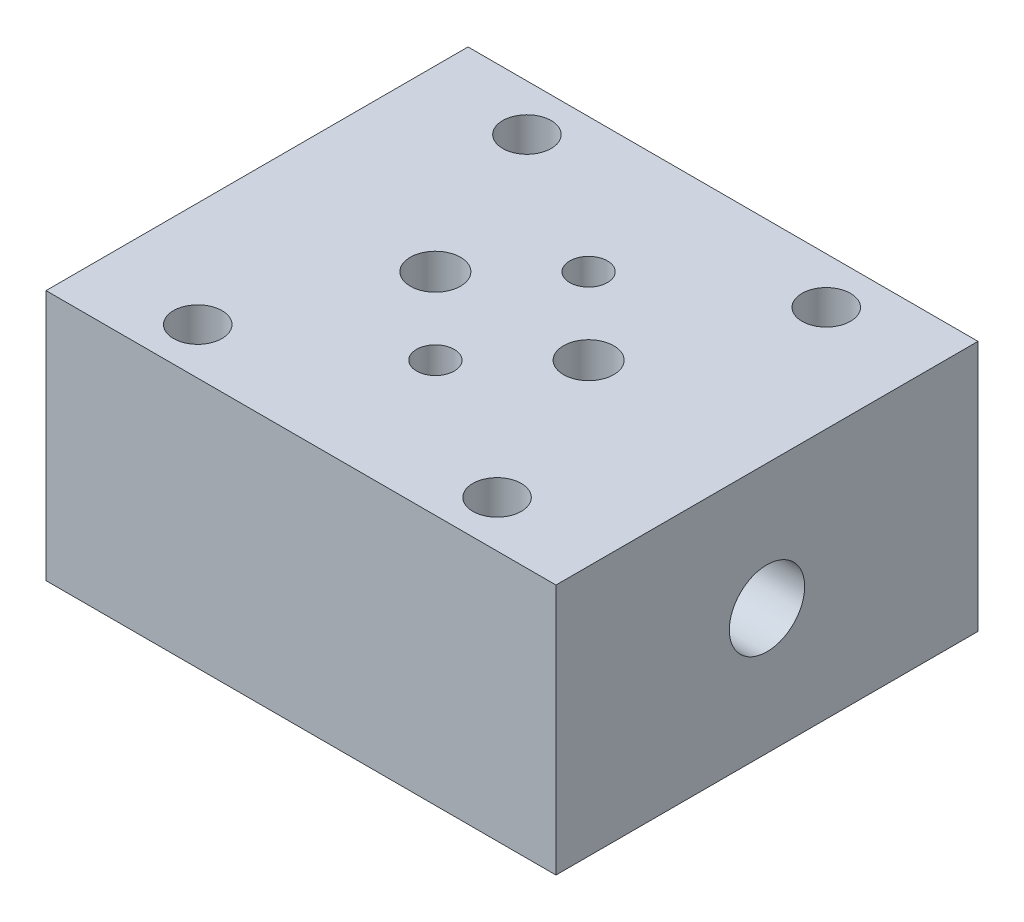
ISO-10303-21;
HEADER;
FILE_DESCRIPTION(('STEP AP214'),'2;1');
FILE_NAME('part.step','',(''),(''),'','','');
FILE_SCHEMA(('AUTOMOTIVE_DESIGN { 1 0 10303 214 1 1 1 1 }'));
ENDSEC;
DATA;
#1=APPLICATION_CONTEXT('core data for automotive mechanical design processes');
#2=APPLICATION_PROTOCOL_DEFINITION('international standard','automotive_design',2000,#1);
#3=PRODUCT_CONTEXT('',#1,'mechanical');
#4=PRODUCT('Part','Part','',(#3));
#5=PRODUCT_RELATED_PRODUCT_CATEGORY('part','',(#4));
#6=PRODUCT_DEFINITION_FORMATION('','',#4);
#7=PRODUCT_DEFINITION_CONTEXT('part definition',#1,'design');
#8=PRODUCT_DEFINITION('design','',#6,#7);
#9=PRODUCT_DEFINITION_SHAPE('','',#8);
#10=(LENGTH_UNIT() NAMED_UNIT(*) SI_UNIT(.MILLI.,.METRE.));
#11=(NAMED_UNIT(*) PLANE_ANGLE_UNIT() SI_UNIT($,.RADIAN.));
#12=(NAMED_UNIT(*) SI_UNIT($,.STERADIAN.) SOLID_ANGLE_UNIT());
#13=UNCERTAINTY_MEASURE_WITH_UNIT(LENGTH_MEASURE(1.E-05),#10,'distance_accuracy_value','');
#14=(GEOMETRIC_REPRESENTATION_CONTEXT(3) GLOBAL_UNCERTAINTY_ASSIGNED_CONTEXT((#13)) GLOBAL_UNIT_ASSIGNED_CONTEXT((#10,
#11,#12)) REPRESENTATION_CONTEXT('',''));
#15=CARTESIAN_POINT('',(0.,0.,0.));
#16=DIRECTION('',(0.,0.,1.));
#17=DIRECTION('',(1.,0.,0.));
#18=AXIS2_PLACEMENT_3D('',#15,#16,#17);
#19=CARTESIAN_POINT('',(19.4007998037815,5.,6.48538918452007));
#20=DIRECTION('',(0.,1.,0.));
#21=DIRECTION('',(0.,0.,1.));
#22=AXIS2_PLACEMENT_3D('',#19,#20,#21);
#23=CYLINDRICAL_SURFACE('',#22,2.);
#24=CARTESIAN_POINT('',(19.4007998037815,20.,6.48538918452007));
#25=DIRECTION('',(0.,1.,0.));
#26=DIRECTION('',(0.,0.,1.));
#27=AXIS2_PLACEMENT_3D('',#24,#25,#26);
#28=CIRCLE('',#27,2.);
#29=CARTESIAN_POINT('',(19.4007998037815,20.,8.48538918452007));
#30=VERTEX_POINT('',#29);
#31=EDGE_CURVE('E143',#30,#30,#28,.T.);
#32=ORIENTED_EDGE('',*,*,#31,.T.);
#33=EDGE_LOOP('',(#32));
#34=FACE_BOUND('',#33,.T.);
#35=CARTESIAN_POINT('',(19.4007998037815,5.,6.48538918452007));
#36=DIRECTION('',(0.,1.,0.));
#37=DIRECTION('',(0.,0.,1.));
#38=AXIS2_PLACEMENT_3D('',#35,#36,#37);
#39=CIRCLE('',#38,2.);
#40=CARTESIAN_POINT('',(19.4007998037815,5.,8.48538918452007));
#41=VERTEX_POINT('',#40);
#42=EDGE_CURVE('E146',#41,#41,#39,.T.);
#43=ORIENTED_EDGE('',*,*,#42,.F.);
#44=EDGE_LOOP('',(#43));
#45=FACE_BOUND('',#44,.T.);
#46=DIRECTION('',(0.,1.,0.));
#47=VECTOR('',#46,1.);
#48=CARTESIAN_POINT('',(19.4007998037815,5.,4.48538918452006));
#49=LINE('',#48,#47);
#50=CARTESIAN_POINT('',(19.4007998037815,12.2360679774998,4.48538918452006));
#51=VERTEX_POINT('',#50);
#52=CARTESIAN_POINT('',(19.4007998037815,7.76393202250021,4.48538918452006));
#53=VERTEX_POINT('',#52);
#54=EDGE_CURVE('E11',#51,#53,#49,.F.);
#55=ORIENTED_EDGE('',*,*,#54,.F.);
#56=CARTESIAN_POINT('',(19.4007998037815,12.2360679774998,4.48538918452006));
#57=CARTESIAN_POINT('',(19.4499647734324,12.2360408995684,4.48537636616661));
#58=CARTESIAN_POINT('',(19.4991129010475,12.2376887690479,4.48720150235003));
#59=CARTESIAN_POINT('',(19.596874810353,12.2441260715054,4.49442461517438));
#60=CARTESIAN_POINT('',(19.6454892194808,12.2489112944528,4.49981780391529));
#61=CARTESIAN_POINT('',(19.7413417652535,12.2613543003402,4.51400410998131));
#62=CARTESIAN_POINT('',(19.7885887489332,12.2689832714284,4.52276315227782));
#63=CARTESIAN_POINT('',(19.8818763751846,12.2867743269629,4.54352130390386));
#64=CARTESIAN_POINT('',(19.9279166625893,12.2969371481469,4.55552135566803));
#65=CARTESIAN_POINT('',(20.0633515173793,12.3305283350678,4.59598157941095));
#66=CARTESIAN_POINT('',(20.1506379552706,12.3571426521571,4.62899053998672));
#67=CARTESIAN_POINT('',(20.3184687006029,12.415757884936,4.7059357345117));
#68=CARTESIAN_POINT('',(20.3989929659931,12.4477740215534,4.74990301806204));
#69=CARTESIAN_POINT('',(20.5644663946895,12.51947102857,4.85538006993717));
#70=CARTESIAN_POINT('',(20.6481780443333,12.5595719731871,4.91855045360234));
#71=CARTESIAN_POINT('',(20.8048454458022,12.63947107422,5.05724020255702));
#72=CARTESIAN_POINT('',(20.8777967624043,12.6792690994033,5.13276463307106));
#73=CARTESIAN_POINT('',(21.0214392729996,12.7608860193993,5.3072276798983));
#74=CARTESIAN_POINT('',(21.090275565014,12.8021638764738,5.40797301827075));
#75=CARTESIAN_POINT('',(21.2094371942173,12.875581769195,5.62290729270841));
#76=CARTESIAN_POINT('',(21.2597814560676,12.9077311392013,5.73708232596091));
#77=CARTESIAN_POINT('',(21.3343563045126,12.9559991552633,5.96214048983405));
#78=CARTESIAN_POINT('',(21.3608833307903,12.9735118806818,6.07195524704095));
#79=CARTESIAN_POINT('',(21.3949843553362,12.9960974921886,6.29569455234626));
#80=CARTESIAN_POINT('',(21.4025823571678,13.0011861328765,6.40961370946628));
#81=CARTESIAN_POINT('',(21.3986273520446,12.9985536167691,6.61953624798767));
#82=CARTESIAN_POINT('',(21.3898107500567,12.9926626472388,6.71562985022697));
#83=CARTESIAN_POINT('',(21.3587087458107,12.9720818238004,6.90462784489725));
#84=CARTESIAN_POINT('',(21.3364223651727,12.9573913307379,6.99753200514443));
#85=CARTESIAN_POINT('',(21.279604124101,12.9205209186642,7.1774671129613));
#86=CARTESIAN_POINT('',(21.2451209342582,12.8983707834527,7.26451979082876));
#87=CARTESIAN_POINT('',(21.1652461617187,12.8482110515085,7.43159831808515));
#88=CARTESIAN_POINT('',(21.119852585565,12.8202003841082,7.51162287970124));
#89=CARTESIAN_POINT('',(21.0128202851267,12.7561800916327,7.67367471608597));
#90=CARTESIAN_POINT('',(20.9498306112334,12.7196030196958,7.7545830018452));
#91=CARTESIAN_POINT('',(20.8128988459059,12.6440049067215,7.90537926948233));
#92=CARTESIAN_POINT('',(20.7389401698465,12.6049802174796,7.97525022720393));
#93=CARTESIAN_POINT('',(20.5688505255753,12.5215069196579,8.11310077854603));
#94=CARTESIAN_POINT('',(20.4710597945213,12.4771559177186,8.17910592928687));
#95=CARTESIAN_POINT('',(20.2633197038193,12.3947675164153,8.29372355769806));
#96=CARTESIAN_POINT('',(20.1533875098997,12.3567213888442,8.34236018927069));
#97=CARTESIAN_POINT('',(19.955476751104,12.3024605615746,8.40892213386435));
#98=CARTESIAN_POINT('',(19.8699675040186,12.2831159097976,8.43163329778911));
#99=CARTESIAN_POINT('',(19.6952660433623,12.2537482390292,8.46557647402768));
#100=CARTESIAN_POINT('',(19.6060871054216,12.2436942570448,8.47684662823674));
#101=CARTESIAN_POINT('',(19.4971782249571,12.238059656323,8.48315977191144));
#102=CARTESIAN_POINT('',(19.4779171509589,12.2373135596547,8.48399546689792));
#103=CARTESIAN_POINT('',(19.4393727552987,12.2363185501528,8.48510952167194));
#104=CARTESIAN_POINT('',(19.4200894437074,12.2360694644473,8.48538807524626));
#105=CARTESIAN_POINT('',(19.4007998037814,12.2360679775017,8.48538918452008));
#106=B_SPLINE_CURVE_WITH_KNOTS('',3,(#56,#57,#58,#59,#60,#61,#62,#63,#64,#65,#66,#67,#68,#69,
#70,#71,#72,#73,#74,#75,#76,#77,#78,#79,#80,#81,#82,#83,#84,#85,#86,#87,#88,#89,#90,#91,#92,#93,
#94,#95,#96,#97,#98,#99,#100,#101,#102,#103,#104,#105),.UNSPECIFIED.,.F.,.F.,(4,2,2,2,2,2,2,2,2,
2,2,2,2,2,2,2,2,2,2,2,2,2,2,2,4),(0.,0.147406300687013,0.294615199850158,0.440371468528525,
0.586170166557266,0.876018614460536,1.16669785357649,1.50227319340302,1.8379864673532,
2.22228321167105,2.60618556535439,2.94700730730402,3.28739663869946,3.57602666306446,
3.86467765464593,4.15218956183312,4.43975404084692,4.765111211512,5.09096541903239,
5.46736342837469,5.84323593441965,6.11388644404437,6.38363166955506,6.44150448447684,
6.49935716638087),.UNSPECIFIED.);
#107=CARTESIAN_POINT('',(19.4007998037815,12.2360679774998,8.48538918452007));
#108=VERTEX_POINT('',#107);
#109=EDGE_CURVE('E39',#51,#108,#106,.T.);
#110=ORIENTED_EDGE('',*,*,#109,.T.);
#111=DIRECTION('',(0.,1.,0.));
#112=VECTOR('',#111,1.);
#113=CARTESIAN_POINT('',(19.4007998037815,5.,8.48538918452007));
#114=LINE('',#113,#112);
#115=CARTESIAN_POINT('',(19.4007998037815,7.76393202250021,8.48538918452007));
#116=VERTEX_POINT('',#115);
#117=EDGE_CURVE('E105',#116,#108,#114,.T.);
#118=ORIENTED_EDGE('',*,*,#117,.F.);
#119=CARTESIAN_POINT('',(19.4007998037815,7.76393202250021,8.48538918452007));
#120=CARTESIAN_POINT('',(19.4499647734324,7.76395910043157,8.48540200287352));
#121=CARTESIAN_POINT('',(19.4991129010475,7.76231123095212,8.48357686669011));
#122=CARTESIAN_POINT('',(19.596874810353,7.75587392849462,8.47635375386575));
#123=CARTESIAN_POINT('',(19.6454892194808,7.75108870554722,8.47096056512484));
#124=CARTESIAN_POINT('',(19.7413417652535,7.73864569965977,8.45677425905883));
#125=CARTESIAN_POINT('',(19.7885887489332,7.73101672857161,8.44801521676232));
#126=CARTESIAN_POINT('',(19.8818763751846,7.71322567303706,8.42725706513627));
#127=CARTESIAN_POINT('',(19.9279166625893,7.70306285185305,8.4152570133721));
#128=CARTESIAN_POINT('',(20.0633515173793,7.66947166493216,8.37479678962918));
#129=CARTESIAN_POINT('',(20.1506379552706,7.64285734784288,8.34178782905342));
#130=CARTESIAN_POINT('',(20.3184687006029,7.58424211506401,8.26484263452844));
#131=CARTESIAN_POINT('',(20.3989929659931,7.55222597844662,8.22087535097809));
#132=CARTESIAN_POINT('',(20.5644663946895,7.48052897142999,8.11539829910296));
#133=CARTESIAN_POINT('',(20.6481780443333,7.44042802681293,8.05222791543779));
#134=CARTESIAN_POINT('',(20.8048454458022,7.36052892578002,7.91353816648311));
#135=CARTESIAN_POINT('',(20.8777967624043,7.3207309005967,7.83801373596908));
#136=CARTESIAN_POINT('',(21.0214392729996,7.2391139806007,7.66355068914183));
#137=CARTESIAN_POINT('',(21.090275565014,7.19783612352618,7.56280535076938));
#138=CARTESIAN_POINT('',(21.2094371942173,7.12441823080498,7.34787107633172));
#139=CARTESIAN_POINT('',(21.2597814560676,7.09226886079873,7.23369604307923));
#140=CARTESIAN_POINT('',(21.3343563045126,7.04400084473673,7.00863787920608));
#141=CARTESIAN_POINT('',(21.3608833307903,7.02648811931819,6.89882312199919));
#142=CARTESIAN_POINT('',(21.3949843553362,7.00390250781142,6.67508381669387));
#143=CARTESIAN_POINT('',(21.4025823571678,6.99881386712345,6.56116465957385));
#144=CARTESIAN_POINT('',(21.3986273520446,7.00144638323092,6.35124212105246));
#145=CARTESIAN_POINT('',(21.3898107500567,7.0073373527612,6.25514851881316));
#146=CARTESIAN_POINT('',(21.3587087458107,7.0279181761996,6.06615052414288));
#147=CARTESIAN_POINT('',(21.3364223651727,7.04260866926207,5.9732463638957));
#148=CARTESIAN_POINT('',(21.279604124101,7.07947908133583,5.79331125607883));
#149=CARTESIAN_POINT('',(21.2451209342582,7.10162921654726,5.70625857821138));
#150=CARTESIAN_POINT('',(21.1652461617187,7.15178894849146,5.53918005095498));
#151=CARTESIAN_POINT('',(21.119852585565,7.17979961589179,5.4591554893389));
#152=CARTESIAN_POINT('',(21.0128202851267,7.24381990836728,5.29710365295417));
#153=CARTESIAN_POINT('',(20.9498306112334,7.28039698030419,5.21619536719493));
#154=CARTESIAN_POINT('',(20.8128988459059,7.35599509327846,5.0653990995578));
#155=CARTESIAN_POINT('',(20.7389401698465,7.3950197825204,4.9955281418362));
#156=CARTESIAN_POINT('',(20.5688505255753,7.47849308034207,4.8576775904941));
#157=CARTESIAN_POINT('',(20.4710597945213,7.52284408228136,4.79167243975326));
#158=CARTESIAN_POINT('',(20.2633197038193,7.60523248358472,4.67705481134208));
#159=CARTESIAN_POINT('',(20.1533875098997,7.64327861115585,4.62841817976945));
#160=CARTESIAN_POINT('',(19.955476751104,7.69753943842541,4.56185623517579));
#161=CARTESIAN_POINT('',(19.8699675040186,7.71688409020236,4.53914507125102));
#162=CARTESIAN_POINT('',(19.6952660433623,7.74625176097085,4.50520189501245));
#163=CARTESIAN_POINT('',(19.6060871054216,7.75630574295522,4.4939317408034));
#164=CARTESIAN_POINT('',(19.4971782249571,7.76194034367702,4.48761859712869));
#165=CARTESIAN_POINT('',(19.4779171509589,7.76268644034534,4.48678290214222));
#166=CARTESIAN_POINT('',(19.4393727552987,7.7636814498472,4.4856688473682));
#167=CARTESIAN_POINT('',(19.4200894437074,7.76393053555267,4.48539029379388));
#168=CARTESIAN_POINT('',(19.4007998037814,7.76393202249831,4.48538918452005));
#169=B_SPLINE_CURVE_WITH_KNOTS('',3,(#119,#120,#121,#122,#123,#124,#125,#126,#127,#128,#129,
#130,#131,#132,#133,#134,#135,#136,#137,#138,#139,#140,#141,#142,#143,#144,#145,#146,#147,#148,
#149,#150,#151,#152,#153,#154,#155,#156,#157,#158,#159,#160,#161,#162,#163,#164,#165,#166,#167,
#168),.UNSPECIFIED.,.F.,.F.,(4,2,2,2,2,2,2,2,2,2,2,2,2,2,2,2,2,2,2,2,2,2,2,2,4),(0.,
0.147406300687014,0.294615199850157,0.440371468528529,0.586170166557266,0.876018614460532,
1.16669785357649,1.50227319340302,1.8379864673532,2.22228321167105,2.60618556535439,
2.94700730730402,3.28739663869946,3.57602666306446,3.86467765464593,4.15218956183312,
4.43975404084692,4.76511121151201,5.09096541903239,5.46736342837469,5.84323593441965,
6.11388644404436,6.38363166955505,6.44150448447684,6.49935716638087),.UNSPECIFIED.);
#170=EDGE_CURVE('E100',#116,#53,#169,.T.);
#171=ORIENTED_EDGE('',*,*,#170,.T.);
#172=EDGE_LOOP('',(#55,#110,#118,#171));
#173=FACE_BOUND('',#172,.T.);
#174=ADVANCED_FACE('F31',(#34,#45,#173),#23,.F.);
#175=CARTESIAN_POINT('',(-6.99920019621852,20.,-10.3146108154799));
#176=DIRECTION('',(1.,0.,0.));
#177=DIRECTION('',(0.,0.,-1.));
#178=AXIS2_PLACEMENT_3D('',#175,#176,#177);
#179=PLANE('',#178);
#180=DIRECTION('',(0.,0.,1.));
#181=VECTOR('',#180,1.);
#182=CARTESIAN_POINT('',(-6.99920019621852,0.,-10.3146108154799));
#183=LINE('',#182,#181);
#184=CARTESIAN_POINT('',(-6.99920019621852,0.,-10.3146108154799));
#185=VERTEX_POINT('',#184);
#186=CARTESIAN_POINT('',(-6.99920019621852,0.,23.2853891845201));
#187=VERTEX_POINT('',#186);
#188=EDGE_CURVE('E192',#185,#187,#183,.T.);
#189=ORIENTED_EDGE('',*,*,#188,.T.);
#190=DIRECTION('',(0.,-1.,0.));
#191=VECTOR('',#190,1.);
#192=CARTESIAN_POINT('',(-6.99920019621852,20.,23.2853891845201));
#193=LINE('',#192,#191);
#194=CARTESIAN_POINT('',(-6.99920019621852,20.,23.2853891845201));
#195=VERTEX_POINT('',#194);
#196=EDGE_CURVE('E107',#195,#187,#193,.T.);
#197=ORIENTED_EDGE('',*,*,#196,.F.);
#198=DIRECTION('',(0.,0.,1.));
#199=VECTOR('',#198,1.);
#200=CARTESIAN_POINT('',(-6.99920019621852,20.,-10.3146108154799));
#201=LINE('',#200,#199);
#202=CARTESIAN_POINT('',(-6.99920019621852,20.,-10.3146108154799));
#203=VERTEX_POINT('',#202);
#204=EDGE_CURVE('E195',#203,#195,#201,.T.);
#205=ORIENTED_EDGE('',*,*,#204,.F.);
#206=DIRECTION('',(0.,-1.,0.));
#207=VECTOR('',#206,1.);
#208=CARTESIAN_POINT('',(-6.99920019621852,20.,-10.3146108154799));
#209=LINE('',#208,#207);
#210=EDGE_CURVE('E201',#203,#185,#209,.T.);
#211=ORIENTED_EDGE('',*,*,#210,.T.);
#212=EDGE_LOOP('',(#189,#197,#205,#211));
#213=FACE_BOUND('',#212,.T.);
#214=ADVANCED_FACE('F33',(#213),#179,.F.);
#215=CARTESIAN_POINT('',(-6.99920019621852,20.,23.2853891845201));
#216=DIRECTION('',(0.,0.,-1.));
#217=DIRECTION('',(-1.,0.,0.));
#218=AXIS2_PLACEMENT_3D('',#215,#216,#217);
#219=PLANE('',#218);
#220=DIRECTION('',(1.,0.,0.));
#221=VECTOR('',#220,1.);
#222=CARTESIAN_POINT('',(-6.99920019621852,0.,23.2853891845201));
#223=LINE('',#222,#221);
#224=CARTESIAN_POINT('',(33.6007998037815,0.,23.2853891845201));
#225=VERTEX_POINT('',#224);
#226=EDGE_CURVE('E204',#187,#225,#223,.T.);
#227=ORIENTED_EDGE('',*,*,#226,.T.);
#228=DIRECTION('',(0.,-1.,0.));
#229=VECTOR('',#228,1.);
#230=CARTESIAN_POINT('',(33.6007998037815,20.,23.2853891845201));
#231=LINE('',#230,#229);
#232=CARTESIAN_POINT('',(33.6007998037815,20.,23.2853891845201));
#233=VERTEX_POINT('',#232);
#234=EDGE_CURVE('E212',#233,#225,#231,.T.);
#235=ORIENTED_EDGE('',*,*,#234,.F.);
#236=DIRECTION('',(1.,0.,0.));
#237=VECTOR('',#236,1.);
#238=CARTESIAN_POINT('',(-6.99920019621852,20.,23.2853891845201));
#239=LINE('',#238,#237);
#240=EDGE_CURVE('E83',#195,#233,#239,.T.);
#241=ORIENTED_EDGE('',*,*,#240,.F.);
#242=ORIENTED_EDGE('',*,*,#196,.T.);
#243=EDGE_LOOP('',(#227,#235,#241,#242));
#244=FACE_BOUND('',#243,.T.);
#245=ADVANCED_FACE('F138',(#244),#219,.F.);
#246=CARTESIAN_POINT('',(33.6007998037815,20.,-10.3146108154799));
#247=DIRECTION('',(-1.,0.,0.));
#248=DIRECTION('',(0.,0.,1.));
#249=AXIS2_PLACEMENT_3D('',#246,#247,#248);
#250=PLANE('',#249);
#251=CARTESIAN_POINT('',(33.6007998037815,10.,6.48538918452007));
#252=DIRECTION('',(1.,0.,0.));
#253=DIRECTION('',(0.,0.,-1.));
#254=AXIS2_PLACEMENT_3D('',#251,#252,#253);
#255=CIRCLE('',#254,3.);
#256=CARTESIAN_POINT('',(33.6007998037815,10.,3.48538918452007));
#257=VERTEX_POINT('',#256);
#258=EDGE_CURVE('E103',#257,#257,#255,.T.);
#259=ORIENTED_EDGE('',*,*,#258,.F.);
#260=EDGE_LOOP('',(#259));
#261=FACE_BOUND('',#260,.T.);
#262=DIRECTION('',(0.,0.,-1.));
#263=VECTOR('',#262,1.);
#264=CARTESIAN_POINT('',(33.6007998037815,0.,-10.3146108154799));
#265=LINE('',#264,#263);
#266=CARTESIAN_POINT('',(33.6007998037815,0.,-10.3146108154799));
#267=VERTEX_POINT('',#266);
#268=EDGE_CURVE('E206',#225,#267,#265,.T.);
#269=ORIENTED_EDGE('',*,*,#268,.T.);
#270=DIRECTION('',(0.,-1.,0.));
#271=VECTOR('',#270,1.);
#272=CARTESIAN_POINT('',(33.6007998037815,20.,-10.3146108154799));
#273=LINE('',#272,#271);
#274=CARTESIAN_POINT('',(33.6007998037815,20.,-10.3146108154799));
#275=VERTEX_POINT('',#274);
#276=EDGE_CURVE('E210',#275,#267,#273,.T.);
#277=ORIENTED_EDGE('',*,*,#276,.F.);
#278=DIRECTION('',(0.,0.,-1.));
#279=VECTOR('',#278,1.);
#280=CARTESIAN_POINT('',(33.6007998037815,20.,-10.3146108154799));
#281=LINE('',#280,#279);
#282=EDGE_CURVE('E198',#233,#275,#281,.T.);
#283=ORIENTED_EDGE('',*,*,#282,.F.);
#284=ORIENTED_EDGE('',*,*,#234,.T.);
#285=EDGE_LOOP('',(#269,#277,#283,#284));
#286=FACE_BOUND('',#285,.T.);
#287=ADVANCED_FACE('F222',(#261,#286),#250,.F.);
#288=CARTESIAN_POINT('',(-6.99920019621852,20.,-10.3146108154799));
#289=DIRECTION('',(0.,0.,1.));
#290=DIRECTION('',(1.,0.,0.));
#291=AXIS2_PLACEMENT_3D('',#288,#289,#290);
#292=PLANE('',#291);
#293=DIRECTION('',(-1.,0.,0.));
#294=VECTOR('',#293,1.);
#295=CARTESIAN_POINT('',(-6.99920019621852,0.,-10.3146108154799));
#296=LINE('',#295,#294);
#297=EDGE_CURVE('E75',#267,#185,#296,.T.);
#298=ORIENTED_EDGE('',*,*,#297,.T.);
#299=ORIENTED_EDGE('',*,*,#210,.F.);
#300=DIRECTION('',(-1.,0.,0.));
#301=VECTOR('',#300,1.);
#302=CARTESIAN_POINT('',(-6.99920019621852,20.,-10.3146108154799));
#303=LINE('',#302,#301);
#304=EDGE_CURVE('E54',#275,#203,#303,.T.);
#305=ORIENTED_EDGE('',*,*,#304,.F.);
#306=ORIENTED_EDGE('',*,*,#276,.T.);
#307=EDGE_LOOP('',(#298,#299,#305,#306));
#308=FACE_BOUND('',#307,.T.);
#309=ADVANCED_FACE('F224',(#308),#292,.F.);
#310=CARTESIAN_POINT('',(-6.99920019621852,20.,23.2853891845201));
#311=DIRECTION('',(0.,1.,0.));
#312=DIRECTION('',(0.,0.,1.));
#313=AXIS2_PLACEMENT_3D('',#310,#311,#312);
#314=PLANE('',#313);
#315=ORIENTED_EDGE('',*,*,#31,.F.);
#316=EDGE_LOOP('',(#315));
#317=FACE_BOUND('',#316,.T.);
#318=CARTESIAN_POINT('',(7.20079980378148,20.,6.48538918452007));
#319=DIRECTION('',(0.,1.,0.));
#320=DIRECTION('',(0.,0.,1.));
#321=AXIS2_PLACEMENT_3D('',#318,#319,#320);
#322=CIRCLE('',#321,2.);
#323=CARTESIAN_POINT('',(7.20079980378148,20.,8.48538918452007));
#324=VERTEX_POINT('',#323);
#325=EDGE_CURVE('E153',#324,#324,#322,.T.);
#326=ORIENTED_EDGE('',*,*,#325,.F.);
#327=EDGE_LOOP('',(#326));
#328=FACE_BOUND('',#327,.T.);
#329=CARTESIAN_POINT('',(13.3007998037815,20.,0.385389184520067));
#330=DIRECTION('',(0.,1.,0.));
#331=DIRECTION('',(0.,0.,1.));
#332=AXIS2_PLACEMENT_3D('',#329,#330,#331);
#333=CIRCLE('',#332,1.5);
#334=CARTESIAN_POINT('',(13.3007998037815,20.,1.88538918452007));
#335=VERTEX_POINT('',#334);
#336=EDGE_CURVE('E159',#335,#335,#333,.T.);
#337=ORIENTED_EDGE('',*,*,#336,.F.);
#338=EDGE_LOOP('',(#337));
#339=FACE_BOUND('',#338,.T.);
#340=CARTESIAN_POINT('',(13.3007998037815,20.,12.5853891845201));
#341=DIRECTION('',(0.,1.,0.));
#342=DIRECTION('',(0.,0.,1.));
#343=AXIS2_PLACEMENT_3D('',#340,#341,#342);
#344=CIRCLE('',#343,1.5);
#345=CARTESIAN_POINT('',(13.3007998037815,20.,14.0853891845201));
#346=VERTEX_POINT('',#345);
#347=EDGE_CURVE('E162',#346,#346,#344,.T.);
#348=ORIENTED_EDGE('',*,*,#347,.F.);
#349=EDGE_LOOP('',(#348));
#350=FACE_BOUND('',#349,.T.);
#351=CARTESIAN_POINT('',(25.2157998037815,20.,-6.61961081547993));
#352=DIRECTION('',(0.,1.,0.));
#353=DIRECTION('',(0.,0.,1.));
#354=AXIS2_PLACEMENT_3D('',#351,#352,#353);
#355=CIRCLE('',#354,1.93);
#356=CARTESIAN_POINT('',(25.2157998037815,20.,-4.68961081547993));
#357=VERTEX_POINT('',#356);
#358=EDGE_CURVE('E171',#357,#357,#355,.T.);
#359=ORIENTED_EDGE('',*,*,#358,.F.);
#360=EDGE_LOOP('',(#359));
#361=FACE_BOUND('',#360,.T.);
#362=CARTESIAN_POINT('',(1.38579980378148,20.,-6.61961081547993));
#363=DIRECTION('',(0.,1.,0.));
#364=DIRECTION('',(0.,0.,1.));
#365=AXIS2_PLACEMENT_3D('',#362,#363,#364);
#366=CIRCLE('',#365,1.93);
#367=CARTESIAN_POINT('',(1.38579980378148,20.,-4.68961081547993));
#368=VERTEX_POINT('',#367);
#369=EDGE_CURVE('E177',#368,#368,#366,.T.);
#370=ORIENTED_EDGE('',*,*,#369,.F.);
#371=EDGE_LOOP('',(#370));
#372=FACE_BOUND('',#371,.T.);
#373=CARTESIAN_POINT('',(1.38579980378148,20.,19.5903891845201));
#374=DIRECTION('',(0.,1.,0.));
#375=DIRECTION('',(0.,0.,1.));
#376=AXIS2_PLACEMENT_3D('',#373,#374,#375);
#377=CIRCLE('',#376,1.93);
#378=CARTESIAN_POINT('',(1.38579980378148,20.,21.5203891845201));
#379=VERTEX_POINT('',#378);
#380=EDGE_CURVE('E183',#379,#379,#377,.T.);
#381=ORIENTED_EDGE('',*,*,#380,.F.);
#382=EDGE_LOOP('',(#381));
#383=FACE_BOUND('',#382,.T.);
#384=CARTESIAN_POINT('',(25.2157998037815,20.,19.5903891845201));
#385=DIRECTION('',(0.,1.,0.));
#386=DIRECTION('',(0.,0.,1.));
#387=AXIS2_PLACEMENT_3D('',#384,#385,#386);
#388=CIRCLE('',#387,1.93);
#389=CARTESIAN_POINT('',(25.2157998037815,20.,21.5203891845201));
#390=VERTEX_POINT('',#389);
#391=EDGE_CURVE('E186',#390,#390,#388,.T.);
#392=ORIENTED_EDGE('',*,*,#391,.F.);
#393=EDGE_LOOP('',(#392));
#394=FACE_BOUND('',#393,.T.);
#395=ORIENTED_EDGE('',*,*,#204,.T.);
#396=ORIENTED_EDGE('',*,*,#240,.T.);
#397=ORIENTED_EDGE('',*,*,#282,.T.);
#398=ORIENTED_EDGE('',*,*,#304,.T.);
#399=EDGE_LOOP('',(#395,#396,#397,#398));
#400=FACE_BOUND('',#399,.T.);
#401=ADVANCED_FACE('F225',(#317,#328,#339,#350,#361,#372,#383,#394,#400),#314,.T.);
#402=CARTESIAN_POINT('',(-6.99920019621852,0.,23.2853891845201));
#403=DIRECTION('',(0.,1.,0.));
#404=DIRECTION('',(0.,0.,1.));
#405=AXIS2_PLACEMENT_3D('',#402,#403,#404);
#406=PLANE('',#405);
#407=CARTESIAN_POINT('',(25.2157998037815,0.,-6.61961081547993));
#408=DIRECTION('',(0.,1.,0.));
#409=DIRECTION('',(0.,0.,1.));
#410=AXIS2_PLACEMENT_3D('',#407,#408,#409);
#411=CIRCLE('',#410,1.93);
#412=CARTESIAN_POINT('',(25.2157998037815,0.,-4.68961081547993));
#413=VERTEX_POINT('',#412);
#414=EDGE_CURVE('E168',#413,#413,#411,.T.);
#415=ORIENTED_EDGE('',*,*,#414,.T.);
#416=EDGE_LOOP('',(#415));
#417=FACE_BOUND('',#416,.T.);
#418=CARTESIAN_POINT('',(1.38579980378148,0.,-6.61961081547993));
#419=DIRECTION('',(0.,1.,0.));
#420=DIRECTION('',(0.,0.,1.));
#421=AXIS2_PLACEMENT_3D('',#418,#419,#420);
#422=CIRCLE('',#421,1.93);
#423=CARTESIAN_POINT('',(1.38579980378148,0.,-4.68961081547993));
#424=VERTEX_POINT('',#423);
#425=EDGE_CURVE('E174',#424,#424,#422,.T.);
#426=ORIENTED_EDGE('',*,*,#425,.T.);
#427=EDGE_LOOP('',(#426));
#428=FACE_BOUND('',#427,.T.);
#429=CARTESIAN_POINT('',(1.38579980378148,0.,19.5903891845201));
#430=DIRECTION('',(0.,1.,0.));
#431=DIRECTION('',(0.,0.,1.));
#432=AXIS2_PLACEMENT_3D('',#429,#430,#431);
#433=CIRCLE('',#432,1.93);
#434=CARTESIAN_POINT('',(1.38579980378148,0.,21.5203891845201));
#435=VERTEX_POINT('',#434);
#436=EDGE_CURVE('E180',#435,#435,#433,.T.);
#437=ORIENTED_EDGE('',*,*,#436,.T.);
#438=EDGE_LOOP('',(#437));
#439=FACE_BOUND('',#438,.T.);
#440=CARTESIAN_POINT('',(25.2157998037815,0.,19.5903891845201));
#441=DIRECTION('',(0.,1.,0.));
#442=DIRECTION('',(0.,0.,1.));
#443=AXIS2_PLACEMENT_3D('',#440,#441,#442);
#444=CIRCLE('',#443,1.93);
#445=CARTESIAN_POINT('',(25.2157998037815,0.,21.5203891845201));
#446=VERTEX_POINT('',#445);
#447=EDGE_CURVE('E189',#446,#446,#444,.T.);
#448=ORIENTED_EDGE('',*,*,#447,.T.);
#449=EDGE_LOOP('',(#448));
#450=FACE_BOUND('',#449,.T.);
#451=ORIENTED_EDGE('',*,*,#188,.F.);
#452=ORIENTED_EDGE('',*,*,#297,.F.);
#453=ORIENTED_EDGE('',*,*,#268,.F.);
#454=ORIENTED_EDGE('',*,*,#226,.F.);
#455=EDGE_LOOP('',(#451,#452,#453,#454));
#456=FACE_BOUND('',#455,.T.);
#457=ADVANCED_FACE('F218',(#417,#428,#439,#450,#456),#406,.F.);
#458=CARTESIAN_POINT('',(25.2157998037815,0.,19.5903891845201));
#459=DIRECTION('',(0.,1.,0.));
#460=DIRECTION('',(0.,0.,1.));
#461=AXIS2_PLACEMENT_3D('',#458,#459,#460);
#462=CYLINDRICAL_SURFACE('',#461,1.93);
#463=ORIENTED_EDGE('',*,*,#447,.F.);
#464=EDGE_LOOP('',(#463));
#465=FACE_BOUND('',#464,.T.);
#466=ORIENTED_EDGE('',*,*,#391,.T.);
#467=EDGE_LOOP('',(#466));
#468=FACE_BOUND('',#467,.T.);
#469=ADVANCED_FACE('F234',(#465,#468),#462,.F.);
#470=CARTESIAN_POINT('',(1.38579980378148,0.,19.5903891845201));
#471=DIRECTION('',(0.,1.,0.));
#472=DIRECTION('',(0.,0.,1.));
#473=AXIS2_PLACEMENT_3D('',#470,#471,#472);
#474=CYLINDRICAL_SURFACE('',#473,1.93);
#475=ORIENTED_EDGE('',*,*,#436,.F.);
#476=EDGE_LOOP('',(#475));
#477=FACE_BOUND('',#476,.T.);
#478=ORIENTED_EDGE('',*,*,#380,.T.);
#479=EDGE_LOOP('',(#478));
#480=FACE_BOUND('',#479,.T.);
#481=ADVANCED_FACE('F275',(#477,#480),#474,.F.);
#482=CARTESIAN_POINT('',(1.38579980378148,0.,-6.61961081547993));
#483=DIRECTION('',(0.,1.,0.));
#484=DIRECTION('',(0.,0.,1.));
#485=AXIS2_PLACEMENT_3D('',#482,#483,#484);
#486=CYLINDRICAL_SURFACE('',#485,1.93);
#487=ORIENTED_EDGE('',*,*,#425,.F.);
#488=EDGE_LOOP('',(#487));
#489=FACE_BOUND('',#488,.T.);
#490=ORIENTED_EDGE('',*,*,#369,.T.);
#491=EDGE_LOOP('',(#490));
#492=FACE_BOUND('',#491,.T.);
#493=ADVANCED_FACE('F282',(#489,#492),#486,.F.);
#494=CARTESIAN_POINT('',(25.2157998037815,0.,-6.61961081547993));
#495=DIRECTION('',(0.,1.,0.));
#496=DIRECTION('',(0.,0.,1.));
#497=AXIS2_PLACEMENT_3D('',#494,#495,#496);
#498=CYLINDRICAL_SURFACE('',#497,1.93);
#499=ORIENTED_EDGE('',*,*,#414,.F.);
#500=EDGE_LOOP('',(#499));
#501=FACE_BOUND('',#500,.T.);
#502=ORIENTED_EDGE('',*,*,#358,.T.);
#503=EDGE_LOOP('',(#502));
#504=FACE_BOUND('',#503,.T.);
#505=ADVANCED_FACE('F288',(#501,#504),#498,.F.);
#506=CARTESIAN_POINT('',(13.3007998037815,5.,12.5853891845201));
#507=DIRECTION('',(0.,1.,0.));
#508=DIRECTION('',(0.,0.,1.));
#509=AXIS2_PLACEMENT_3D('',#506,#507,#508);
#510=CYLINDRICAL_SURFACE('',#509,1.5);
#511=CARTESIAN_POINT('',(13.3007998037815,5.,12.5853891845201));
#512=DIRECTION('',(0.,1.,0.));
#513=DIRECTION('',(0.,0.,1.));
#514=AXIS2_PLACEMENT_3D('',#511,#512,#513);
#515=CIRCLE('',#514,1.5);
#516=CARTESIAN_POINT('',(13.3007998037815,5.,14.0853891845201));
#517=VERTEX_POINT('',#516);
#518=EDGE_CURVE('E165',#517,#517,#515,.T.);
#519=ORIENTED_EDGE('',*,*,#518,.F.);
#520=EDGE_LOOP('',(#519));
#521=FACE_BOUND('',#520,.T.);
#522=ORIENTED_EDGE('',*,*,#347,.T.);
#523=EDGE_LOOP('',(#522));
#524=FACE_BOUND('',#523,.T.);
#525=ADVANCED_FACE('F294',(#521,#524),#510,.F.);
#526=CARTESIAN_POINT('',(13.3007998037815,5.,12.5853891845201));
#527=DIRECTION('',(0.,1.,0.));
#528=DIRECTION('',(0.,0.,1.));
#529=AXIS2_PLACEMENT_3D('',#526,#527,#528);
#530=PLANE('',#529);
#531=ORIENTED_EDGE('',*,*,#518,.T.);
#532=EDGE_LOOP('',(#531));
#533=FACE_BOUND('',#532,.T.);
#534=ADVANCED_FACE('F307',(#533),#530,.T.);
#535=CARTESIAN_POINT('',(13.3007998037815,5.,0.385389184520067));
#536=DIRECTION('',(0.,1.,0.));
#537=DIRECTION('',(0.,0.,1.));
#538=AXIS2_PLACEMENT_3D('',#535,#536,#537);
#539=CYLINDRICAL_SURFACE('',#538,1.5);
#540=CARTESIAN_POINT('',(13.3007998037815,5.,0.385389184520067));
#541=DIRECTION('',(0.,1.,0.));
#542=DIRECTION('',(0.,0.,1.));
#543=AXIS2_PLACEMENT_3D('',#540,#541,#542);
#544=CIRCLE('',#543,1.5);
#545=CARTESIAN_POINT('',(13.3007998037815,5.,1.88538918452007));
#546=VERTEX_POINT('',#545);
#547=EDGE_CURVE('E156',#546,#546,#544,.T.);
#548=ORIENTED_EDGE('',*,*,#547,.F.);
#549=EDGE_LOOP('',(#548));
#550=FACE_BOUND('',#549,.T.);
#551=ORIENTED_EDGE('',*,*,#336,.T.);
#552=EDGE_LOOP('',(#551));
#553=FACE_BOUND('',#552,.T.);
#554=ADVANCED_FACE('F316',(#550,#553),#539,.F.);
#555=CARTESIAN_POINT('',(13.3007998037815,5.,0.385389184520067));
#556=DIRECTION('',(0.,1.,0.));
#557=DIRECTION('',(0.,0.,1.));
#558=AXIS2_PLACEMENT_3D('',#555,#556,#557);
#559=PLANE('',#558);
#560=ORIENTED_EDGE('',*,*,#547,.T.);
#561=EDGE_LOOP('',(#560));
#562=FACE_BOUND('',#561,.T.);
#563=ADVANCED_FACE('F325',(#562),#559,.T.);
#564=CARTESIAN_POINT('',(7.20079980378148,5.,6.48538918452007));
#565=DIRECTION('',(0.,1.,0.));
#566=DIRECTION('',(0.,0.,1.));
#567=AXIS2_PLACEMENT_3D('',#564,#565,#566);
#568=CYLINDRICAL_SURFACE('',#567,2.);
#569=CARTESIAN_POINT('',(7.20079980378148,5.,6.48538918452007));
#570=DIRECTION('',(0.,1.,0.));
#571=DIRECTION('',(0.,0.,1.));
#572=AXIS2_PLACEMENT_3D('',#569,#570,#571);
#573=CIRCLE('',#572,2.);
#574=CARTESIAN_POINT('',(7.20079980378148,5.,8.48538918452007));
#575=VERTEX_POINT('',#574);
#576=EDGE_CURVE('E149',#575,#575,#573,.T.);
#577=ORIENTED_EDGE('',*,*,#576,.F.);
#578=EDGE_LOOP('',(#577));
#579=FACE_BOUND('',#578,.T.);
#580=ORIENTED_EDGE('',*,*,#325,.T.);
#581=EDGE_LOOP('',(#580));
#582=FACE_BOUND('',#581,.T.);
#583=ADVANCED_FACE('F334',(#579,#582),#568,.F.);
#584=CARTESIAN_POINT('',(7.20079980378148,5.,6.48538918452007));
#585=DIRECTION('',(0.,1.,0.));
#586=DIRECTION('',(0.,0.,1.));
#587=AXIS2_PLACEMENT_3D('',#584,#585,#586);
#588=PLANE('',#587);
#589=ORIENTED_EDGE('',*,*,#576,.T.);
#590=EDGE_LOOP('',(#589));
#591=FACE_BOUND('',#590,.T.);
#592=ADVANCED_FACE('F343',(#591),#588,.T.);
#593=CARTESIAN_POINT('',(19.4007998037815,5.,6.48538918452007));
#594=DIRECTION('',(0.,1.,0.));
#595=DIRECTION('',(0.,0.,1.));
#596=AXIS2_PLACEMENT_3D('',#593,#594,#595);
#597=PLANE('',#596);
#598=ORIENTED_EDGE('',*,*,#42,.T.);
#599=EDGE_LOOP('',(#598));
#600=FACE_BOUND('',#599,.T.);
#601=ADVANCED_FACE('F123',(#600),#597,.T.);
#602=CARTESIAN_POINT('',(19.4007998037815,10.,6.48538918452007));
#603=DIRECTION('',(1.,0.,0.));
#604=DIRECTION('',(0.,0.,-1.));
#605=AXIS2_PLACEMENT_3D('',#602,#603,#604);
#606=CYLINDRICAL_SURFACE('',#605,3.);
#607=ORIENTED_EDGE('',*,*,#258,.T.);
#608=EDGE_LOOP('',(#607));
#609=FACE_BOUND('',#608,.T.);
#610=CARTESIAN_POINT('',(19.4007998037815,10.,6.48538918452007));
#611=DIRECTION('',(1.,0.,0.));
#612=DIRECTION('',(0.,0.,-1.));
#613=AXIS2_PLACEMENT_3D('',#610,#611,#612);
#614=CIRCLE('',#613,3.);
#615=EDGE_CURVE('E95',#53,#51,#614,.T.);
#616=ORIENTED_EDGE('',*,*,#615,.F.);
#617=ORIENTED_EDGE('',*,*,#170,.F.);
#618=EDGE_CURVE('E45',#108,#116,#614,.T.);
#619=ORIENTED_EDGE('',*,*,#618,.F.);
#620=ORIENTED_EDGE('',*,*,#109,.F.);
#621=EDGE_LOOP('',(#616,#617,#619,#620));
#622=FACE_BOUND('',#621,.T.);
#623=ADVANCED_FACE('F94',(#609,#622),#606,.F.);
#624=CARTESIAN_POINT('',(19.4007998037815,10.,6.48538918452007));
#625=DIRECTION('',(1.,0.,0.));
#626=DIRECTION('',(0.,0.,-1.));
#627=AXIS2_PLACEMENT_3D('',#624,#625,#626);
#628=PLANE('',#627);
#629=ORIENTED_EDGE('',*,*,#54,.T.);
#630=ORIENTED_EDGE('',*,*,#615,.T.);
#631=EDGE_LOOP('',(#629,#630));
#632=FACE_BOUND('',#631,.T.);
#633=ADVANCED_FACE('F102',(#632),#628,.T.);
#634=ORIENTED_EDGE('',*,*,#117,.T.);
#635=ORIENTED_EDGE('',*,*,#618,.T.);
#636=EDGE_LOOP('',(#634,#635));
#637=FACE_BOUND('',#636,.T.);
#638=ADVANCED_FACE('F127',(#637),#628,.T.);
#639=CLOSED_SHELL('',(#174,#214,#245,#287,#309,#401,#457,#469,#481,#493,#505,#525,#534,#554,
#563,#583,#592,#601,#623,#633,#638));
#640=MANIFOLD_SOLID_BREP('B2',#639);
#641=ADVANCED_BREP_SHAPE_REPRESENTATION('',(#18,#640),#14);
#642=SHAPE_DEFINITION_REPRESENTATION(#9,#641);
ENDSEC;
END-ISO-10303-21;
